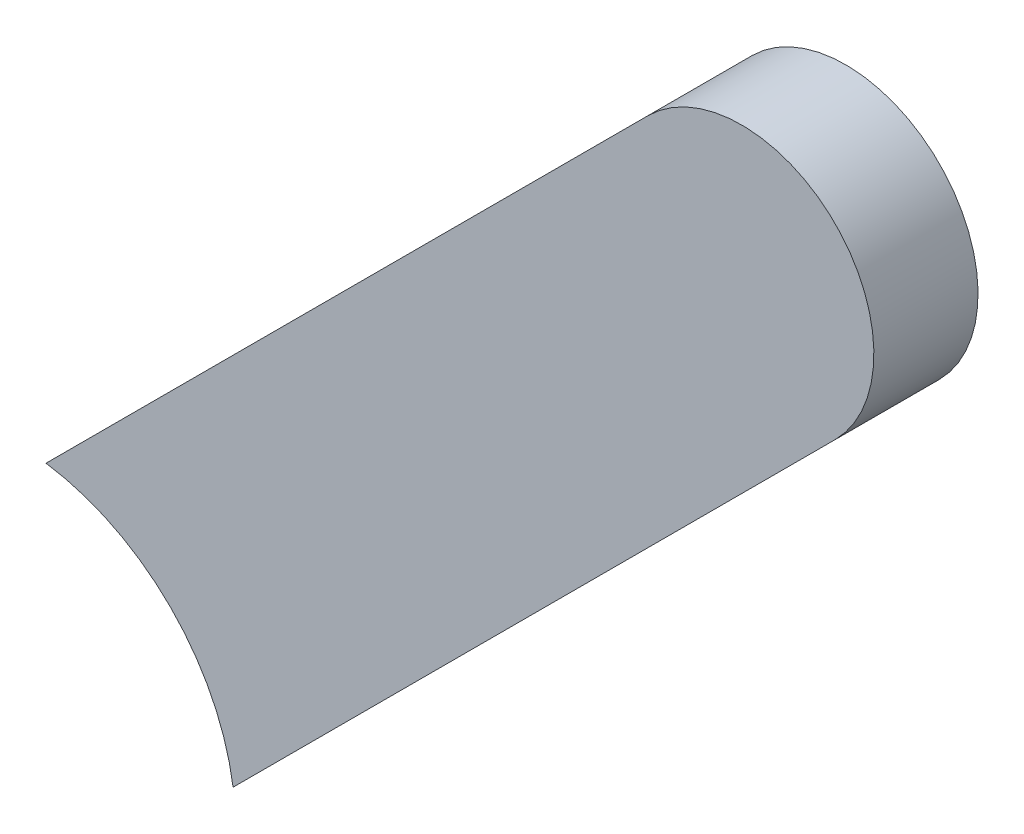
ISO-10303-21;
HEADER;
FILE_DESCRIPTION(('STEP AP214'),'2;1');
FILE_NAME('part.step','',(''),(''),'','','');
FILE_SCHEMA(('AUTOMOTIVE_DESIGN { 1 0 10303 214 1 1 1 1 }'));
ENDSEC;
DATA;
#1=APPLICATION_CONTEXT('core data for automotive mechanical design processes');
#2=APPLICATION_PROTOCOL_DEFINITION('international standard','automotive_design',2000,#1);
#3=PRODUCT_CONTEXT('',#1,'mechanical');
#4=PRODUCT('Part','Part','',(#3));
#5=PRODUCT_RELATED_PRODUCT_CATEGORY('part','',(#4));
#6=PRODUCT_DEFINITION_FORMATION('','',#4);
#7=PRODUCT_DEFINITION_CONTEXT('part definition',#1,'design');
#8=PRODUCT_DEFINITION('design','',#6,#7);
#9=PRODUCT_DEFINITION_SHAPE('','',#8);
#10=(LENGTH_UNIT() NAMED_UNIT(*) SI_UNIT(.MILLI.,.METRE.));
#11=(NAMED_UNIT(*) PLANE_ANGLE_UNIT() SI_UNIT($,.RADIAN.));
#12=(NAMED_UNIT(*) SI_UNIT($,.STERADIAN.) SOLID_ANGLE_UNIT());
#13=UNCERTAINTY_MEASURE_WITH_UNIT(LENGTH_MEASURE(1.E-05),#10,'distance_accuracy_value','');
#14=(GEOMETRIC_REPRESENTATION_CONTEXT(3) GLOBAL_UNCERTAINTY_ASSIGNED_CONTEXT((#13)) GLOBAL_UNIT_ASSIGNED_CONTEXT((#10,
#11,#12)) REPRESENTATION_CONTEXT('',''));
#15=CARTESIAN_POINT('',(0.,0.,0.));
#16=DIRECTION('',(0.,0.,1.));
#17=DIRECTION('',(1.,0.,0.));
#18=AXIS2_PLACEMENT_3D('',#15,#16,#17);
#19=CARTESIAN_POINT('',(104.687550392133,112.329341052133,0.));
#20=DIRECTION('',(-0.707106781186555,0.70710678118654,0.));
#21=DIRECTION('',(0.70710678118654,0.707106781186555,0.));
#22=AXIS2_PLACEMENT_3D('',#19,#20,#21);
#23=PLANE('',#22);
#24=DIRECTION('',(0.70710678118654,0.707106781186555,0.));
#25=VECTOR('',#24,1.);
#26=CARTESIAN_POINT('',(104.4466034,112.08839406,0.1999996));
#27=LINE('',#26,#25);
#28=CARTESIAN_POINT('',(104.687550392133,112.329341052133,0.1999996));
#29=VERTEX_POINT('',#28);
#30=CARTESIAN_POINT('',(105.84360594,113.4853966,0.1999996));
#31=VERTEX_POINT('',#30);
#32=EDGE_CURVE('E11',#29,#31,#27,.T.);
#33=ORIENTED_EDGE('',*,*,#32,.F.);
#34=DIRECTION('',(0.,0.,1.));
#35=VECTOR('',#34,1.);
#36=CARTESIAN_POINT('',(104.687550392133,112.329341052133,0.));
#37=LINE('',#36,#35);
#38=CARTESIAN_POINT('',(104.687550392133,112.329341052133,0.));
#39=VERTEX_POINT('',#38);
#40=EDGE_CURVE('E24',#39,#29,#37,.T.);
#41=ORIENTED_EDGE('',*,*,#40,.F.);
#42=DIRECTION('',(0.70710678118654,0.707106781186555,0.));
#43=VECTOR('',#42,1.);
#44=CARTESIAN_POINT('',(104.4466034,112.08839406,0.));
#45=LINE('',#44,#43);
#46=CARTESIAN_POINT('',(105.84360594,113.4853966,0.));
#47=VERTEX_POINT('',#46);
#48=EDGE_CURVE('E75',#39,#47,#45,.T.);
#49=ORIENTED_EDGE('',*,*,#48,.T.);
#50=DIRECTION('',(0.,0.,1.));
#51=VECTOR('',#50,1.);
#52=CARTESIAN_POINT('',(105.84360594,113.4853966,0.));
#53=LINE('',#52,#51);
#54=EDGE_CURVE('E37',#47,#31,#53,.T.);
#55=ORIENTED_EDGE('',*,*,#54,.T.);
#56=EDGE_LOOP('',(#33,#41,#49,#55));
#57=FACE_BOUND('',#56,.T.);
#58=ADVANCED_FACE('F17',(#57),#23,.F.);
#59=CARTESIAN_POINT('',(105.66400127,113.66500127,0.));
#60=DIRECTION('',(0.,0.,-1.));
#61=DIRECTION('',(0.70710678118652,-0.707106781186576,0.));
#62=AXIS2_PLACEMENT_3D('',#59,#60,#61);
#63=CYLINDRICAL_SURFACE('',#62,0.253999360179536);
#64=CARTESIAN_POINT('',(105.66400127,113.66500127,0.1999996));
#65=DIRECTION('',(0.,0.,1.));
#66=DIRECTION('',(0.70710678118652,-0.707106781186576,0.));
#67=AXIS2_PLACEMENT_3D('',#64,#65,#66);
#68=CIRCLE('',#67,0.253999360179536);
#69=CARTESIAN_POINT('',(105.4843966,113.84460594,0.1999996));
#70=VERTEX_POINT('',#69);
#71=EDGE_CURVE('E83',#31,#70,#68,.T.);
#72=ORIENTED_EDGE('',*,*,#71,.F.);
#73=ORIENTED_EDGE('',*,*,#54,.F.);
#74=CARTESIAN_POINT('',(105.66400127,113.66500127,0.));
#75=DIRECTION('',(0.,0.,1.));
#76=DIRECTION('',(0.70710678118652,-0.707106781186576,0.));
#77=AXIS2_PLACEMENT_3D('',#74,#75,#76);
#78=CIRCLE('',#77,0.253999360179536);
#79=CARTESIAN_POINT('',(105.4843966,113.84460594,0.));
#80=VERTEX_POINT('',#79);
#81=EDGE_CURVE('E81',#47,#80,#78,.T.);
#82=ORIENTED_EDGE('',*,*,#81,.T.);
#83=DIRECTION('',(0.,0.,1.));
#84=VECTOR('',#83,1.);
#85=CARTESIAN_POINT('',(105.4843966,113.84460594,0.));
#86=LINE('',#85,#84);
#87=EDGE_CURVE('E67',#80,#70,#86,.T.);
#88=ORIENTED_EDGE('',*,*,#87,.T.);
#89=EDGE_LOOP('',(#72,#73,#82,#88));
#90=FACE_BOUND('',#89,.T.);
#91=ADVANCED_FACE('F89',(#90),#63,.T.);
#92=CARTESIAN_POINT('',(105.4843966,113.84460594,0.));
#93=DIRECTION('',(0.707106781186544,-0.707106781186551,0.));
#94=DIRECTION('',(-0.707106781186551,-0.707106781186544,0.));
#95=AXIS2_PLACEMENT_3D('',#92,#93,#94);
#96=PLANE('',#95);
#97=DIRECTION('',(-0.707106781186551,-0.707106781186544,0.));
#98=VECTOR('',#97,1.);
#99=CARTESIAN_POINT('',(105.4843966,113.84460594,0.1999996));
#100=LINE('',#99,#98);
#101=CARTESIAN_POINT('',(104.328341052133,112.688550392133,0.1999996));
#102=VERTEX_POINT('',#101);
#103=EDGE_CURVE('E71',#70,#102,#100,.T.);
#104=ORIENTED_EDGE('',*,*,#103,.F.);
#105=ORIENTED_EDGE('',*,*,#87,.F.);
#106=DIRECTION('',(-0.707106781186551,-0.707106781186544,0.));
#107=VECTOR('',#106,1.);
#108=CARTESIAN_POINT('',(105.4843966,113.84460594,0.));
#109=LINE('',#108,#107);
#110=CARTESIAN_POINT('',(104.328341052133,112.688550392133,0.));
#111=VERTEX_POINT('',#110);
#112=EDGE_CURVE('E63',#80,#111,#109,.T.);
#113=ORIENTED_EDGE('',*,*,#112,.T.);
#114=DIRECTION('',(0.,0.,1.));
#115=VECTOR('',#114,1.);
#116=CARTESIAN_POINT('',(104.328341052133,112.688550392133,0.));
#117=LINE('',#116,#115);
#118=EDGE_CURVE('E53',#111,#102,#117,.T.);
#119=ORIENTED_EDGE('',*,*,#118,.T.);
#120=EDGE_LOOP('',(#104,#105,#113,#119));
#121=FACE_BOUND('',#120,.T.);
#122=ADVANCED_FACE('F66',(#121),#96,.F.);
#123=CARTESIAN_POINT('',(104.267,112.268,0.));
#124=DIRECTION('',(0.,0.,-1.));
#125=DIRECTION('',(1.,0.,0.));
#126=AXIS2_PLACEMENT_3D('',#123,#124,#125);
#127=CYLINDRICAL_SURFACE('',#126,0.42500042);
#128=ORIENTED_EDGE('',*,*,#40,.T.);
#129=CARTESIAN_POINT('',(104.267,112.268,0.1999996));
#130=DIRECTION('',(0.,0.,1.));
#131=DIRECTION('',(1.,0.,0.));
#132=AXIS2_PLACEMENT_3D('',#129,#130,#131);
#133=CIRCLE('',#132,0.42500042);
#134=EDGE_CURVE('E59',#29,#102,#133,.T.);
#135=ORIENTED_EDGE('',*,*,#134,.T.);
#136=ORIENTED_EDGE('',*,*,#118,.F.);
#137=CARTESIAN_POINT('',(104.267,112.268,0.));
#138=DIRECTION('',(0.,0.,1.));
#139=DIRECTION('',(1.,0.,0.));
#140=AXIS2_PLACEMENT_3D('',#137,#138,#139);
#141=CIRCLE('',#140,0.42500042);
#142=EDGE_CURVE('E57',#39,#111,#141,.T.);
#143=ORIENTED_EDGE('',*,*,#142,.F.);
#144=EDGE_LOOP('',(#128,#135,#136,#143));
#145=FACE_BOUND('',#144,.T.);
#146=ADVANCED_FACE('F55',(#145),#127,.F.);
#147=CARTESIAN_POINT('',(104.4466034,112.08839406,0.));
#148=DIRECTION('',(0.,0.,-1.));
#149=DIRECTION('',(-1.,0.,0.));
#150=AXIS2_PLACEMENT_3D('',#147,#148,#149);
#151=PLANE('',#150);
#152=ORIENTED_EDGE('',*,*,#48,.F.);
#153=ORIENTED_EDGE('',*,*,#142,.T.);
#154=ORIENTED_EDGE('',*,*,#112,.F.);
#155=ORIENTED_EDGE('',*,*,#81,.F.);
#156=EDGE_LOOP('',(#152,#153,#154,#155));
#157=FACE_BOUND('',#156,.T.);
#158=ADVANCED_FACE('F74',(#157),#151,.T.);
#159=CARTESIAN_POINT('',(104.4466034,112.08839406,0.1999996));
#160=DIRECTION('',(0.,0.,-1.));
#161=DIRECTION('',(-1.,0.,0.));
#162=AXIS2_PLACEMENT_3D('',#159,#160,#161);
#163=PLANE('',#162);
#164=ORIENTED_EDGE('',*,*,#134,.F.);
#165=ORIENTED_EDGE('',*,*,#32,.T.);
#166=ORIENTED_EDGE('',*,*,#71,.T.);
#167=ORIENTED_EDGE('',*,*,#103,.T.);
#168=EDGE_LOOP('',(#164,#165,#166,#167));
#169=FACE_BOUND('',#168,.T.);
#170=ADVANCED_FACE('F91',(#169),#163,.F.);
#171=CLOSED_SHELL('',(#58,#91,#122,#146,#158,#170));
#172=MANIFOLD_SOLID_BREP('B1',#171);
#173=ADVANCED_BREP_SHAPE_REPRESENTATION('',(#18,#172),#14);
#174=SHAPE_DEFINITION_REPRESENTATION(#9,#173);
ENDSEC;
END-ISO-10303-21;
